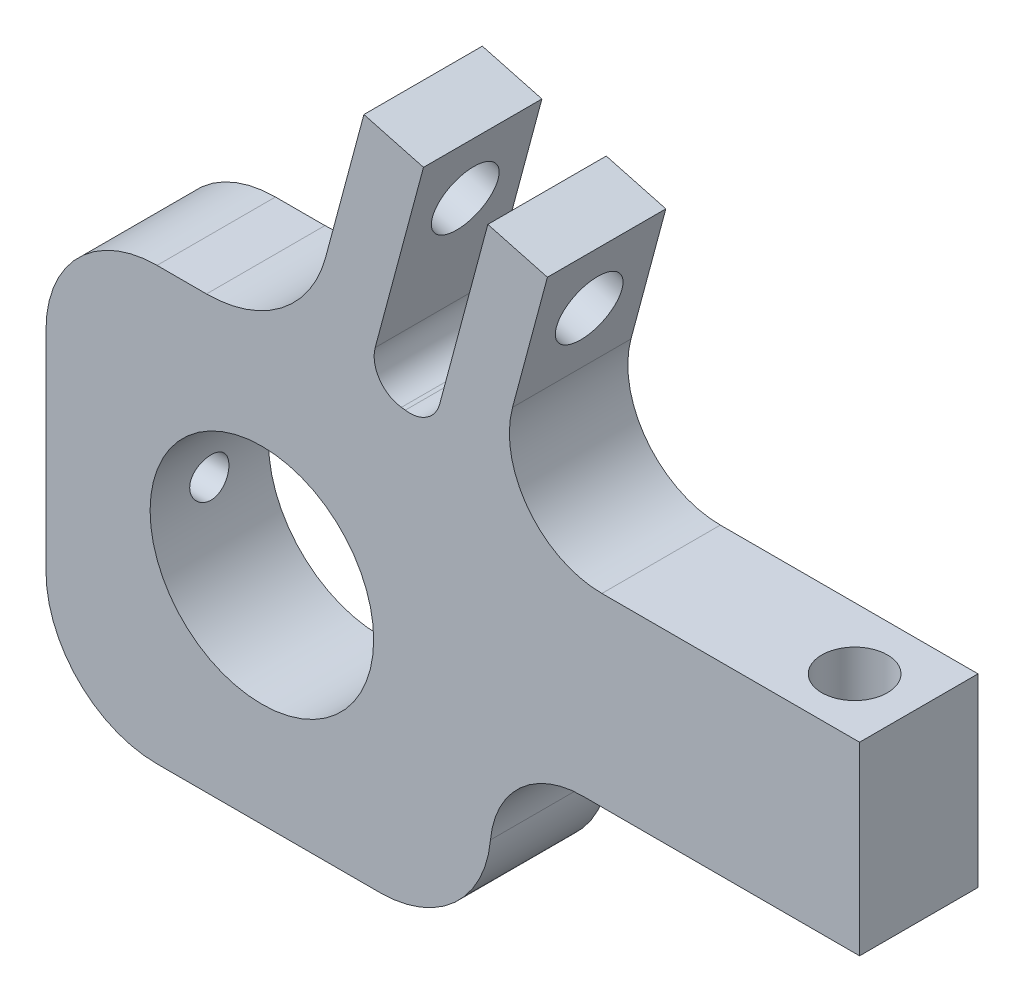
ISO-10303-21;
HEADER;
FILE_DESCRIPTION(('STEP AP214'),'2;1');
FILE_NAME('part.step','',(''),(''),'','','');
FILE_SCHEMA(('AUTOMOTIVE_DESIGN { 1 0 10303 214 1 1 1 1 }'));
ENDSEC;
DATA;
#1=APPLICATION_CONTEXT('core data for automotive mechanical design processes');
#2=APPLICATION_PROTOCOL_DEFINITION('international standard','automotive_design',2000,#1);
#3=PRODUCT_CONTEXT('',#1,'mechanical');
#4=PRODUCT('Part','Part','',(#3));
#5=PRODUCT_RELATED_PRODUCT_CATEGORY('part','',(#4));
#6=PRODUCT_DEFINITION_FORMATION('','',#4);
#7=PRODUCT_DEFINITION_CONTEXT('part definition',#1,'design');
#8=PRODUCT_DEFINITION('design','',#6,#7);
#9=PRODUCT_DEFINITION_SHAPE('','',#8);
#10=(LENGTH_UNIT() NAMED_UNIT(*) SI_UNIT(.MILLI.,.METRE.));
#11=(NAMED_UNIT(*) PLANE_ANGLE_UNIT() SI_UNIT($,.RADIAN.));
#12=(NAMED_UNIT(*) SI_UNIT($,.STERADIAN.) SOLID_ANGLE_UNIT());
#13=UNCERTAINTY_MEASURE_WITH_UNIT(LENGTH_MEASURE(1.E-05),#10,'distance_accuracy_value','');
#14=(GEOMETRIC_REPRESENTATION_CONTEXT(3) GLOBAL_UNCERTAINTY_ASSIGNED_CONTEXT((#13)) GLOBAL_UNIT_ASSIGNED_CONTEXT((#10,
#11,#12)) REPRESENTATION_CONTEXT('',''));
#15=CARTESIAN_POINT('',(0.,0.,0.));
#16=DIRECTION('',(0.,0.,1.));
#17=DIRECTION('',(1.,0.,0.));
#18=AXIS2_PLACEMENT_3D('',#15,#16,#17);
#19=CARTESIAN_POINT('',(0.,0.,6.096));
#20=DIRECTION('',(0.,-1.,0.));
#21=DIRECTION('',(0.,0.,-1.));
#22=AXIS2_PLACEMENT_3D('',#19,#20,#21);
#23=PLANE('',#22);
#24=DIRECTION('',(-1.,0.,0.));
#25=VECTOR('',#24,1.);
#26=CARTESIAN_POINT('',(0.,0.,6.096));
#27=LINE('',#26,#25);
#28=CARTESIAN_POINT('',(16.52517842443,0.,6.096));
#29=VERTEX_POINT('',#28);
#30=CARTESIAN_POINT('',(11.43,0.,6.096));
#31=VERTEX_POINT('',#30);
#32=EDGE_CURVE('E395',#29,#31,#27,.T.);
#33=ORIENTED_EDGE('',*,*,#32,.F.);
#34=DIRECTION('',(0.,0.,-1.));
#35=VECTOR('',#34,1.);
#36=CARTESIAN_POINT('',(16.52517842443,0.,-6.096));
#37=LINE('',#36,#35);
#38=CARTESIAN_POINT('',(16.52517842443,0.,-6.096));
#39=VERTEX_POINT('',#38);
#40=EDGE_CURVE('E333',#29,#39,#37,.T.);
#41=ORIENTED_EDGE('',*,*,#40,.T.);
#42=DIRECTION('',(-1.,0.,0.));
#43=VECTOR('',#42,1.);
#44=CARTESIAN_POINT('',(0.,0.,-6.096));
#45=LINE('',#44,#43);
#46=CARTESIAN_POINT('',(11.43,0.,-6.096));
#47=VERTEX_POINT('',#46);
#48=EDGE_CURVE('E396',#39,#47,#45,.T.);
#49=ORIENTED_EDGE('',*,*,#48,.T.);
#50=DIRECTION('',(0.,0.,-1.));
#51=VECTOR('',#50,1.);
#52=CARTESIAN_POINT('',(11.43,0.,6.096));
#53=LINE('',#52,#51);
#54=EDGE_CURVE('E384',#47,#31,#53,.F.);
#55=ORIENTED_EDGE('',*,*,#54,.T.);
#56=EDGE_LOOP('',(#33,#41,#49,#55));
#57=FACE_BOUND('',#56,.T.);
#58=ADVANCED_FACE('F36',(#57),#23,.F.);
#59=CARTESIAN_POINT('',(35.2757672756502,-11.43,-6.097));
#60=DIRECTION('',(0.,0.,1.));
#61=DIRECTION('',(1.,0.,0.));
#62=AXIS2_PLACEMENT_3D('',#59,#60,#61);
#63=CYLINDRICAL_SURFACE('',#62,11.43);
#64=CARTESIAN_POINT('',(35.2757672756502,-11.43,6.096));
#65=DIRECTION('',(0.,0.,1.));
#66=DIRECTION('',(1.,0.,0.));
#67=AXIS2_PLACEMENT_3D('',#64,#65,#66);
#68=CIRCLE('',#67,11.43);
#69=CARTESIAN_POINT('',(36.9880880456364,-0.128988647883148,6.096));
#70=VERTEX_POINT('',#69);
#71=CARTESIAN_POINT('',(36.5907256389474,-0.0758912942144651,6.096));
#72=VERTEX_POINT('',#71);
#73=EDGE_CURVE('E387',#70,#72,#68,.T.);
#74=ORIENTED_EDGE('',*,*,#73,.F.);
#75=DIRECTION('',(0.,0.,1.));
#76=VECTOR('',#75,1.);
#77=CARTESIAN_POINT('',(36.9880880456364,-0.128988647883146,-6.097));
#78=LINE('',#77,#76);
#79=CARTESIAN_POINT('',(36.9880880456364,-0.128988647883148,-6.096));
#80=VERTEX_POINT('',#79);
#81=EDGE_CURVE('E356',#70,#80,#78,.F.);
#82=ORIENTED_EDGE('',*,*,#81,.T.);
#83=CARTESIAN_POINT('',(35.2757672756502,-11.43,-6.096));
#84=DIRECTION('',(0.,0.,1.));
#85=DIRECTION('',(1.,0.,0.));
#86=AXIS2_PLACEMENT_3D('',#83,#84,#85);
#87=CIRCLE('',#86,11.43);
#88=CARTESIAN_POINT('',(36.5907256389474,-0.0758912942144651,-6.096));
#89=VERTEX_POINT('',#88);
#90=EDGE_CURVE('E374',#89,#80,#87,.F.);
#91=ORIENTED_EDGE('',*,*,#90,.F.);
#92=DIRECTION('',(0.,0.,1.));
#93=VECTOR('',#92,1.);
#94=CARTESIAN_POINT('',(36.5907256389474,-0.0758912942144651,-6.097));
#95=LINE('',#94,#93);
#96=EDGE_CURVE('E359',#89,#72,#95,.T.);
#97=ORIENTED_EDGE('',*,*,#96,.T.);
#98=EDGE_LOOP('',(#74,#82,#91,#97));
#99=FACE_BOUND('',#98,.T.);
#100=ADVANCED_FACE('F280',(#99),#63,.T.);
#101=CARTESIAN_POINT('',(0.,0.,6.096));
#102=DIRECTION('',(1.,0.,0.));
#103=DIRECTION('',(0.,1.,0.));
#104=AXIS2_PLACEMENT_3D('',#101,#102,#103);
#105=PLANE('',#104);
#106=CARTESIAN_POINT('',(0.,-22.225,0.));
#107=DIRECTION('',(-1.,0.,0.));
#108=DIRECTION('',(0.,-1.,0.));
#109=AXIS2_PLACEMENT_3D('',#106,#107,#108);
#110=CIRCLE('',#109,2.0193);
#111=CARTESIAN_POINT('',(0.,-24.2443,0.));
#112=VERTEX_POINT('',#111);
#113=EDGE_CURVE('E231',#112,#112,#110,.T.);
#114=ORIENTED_EDGE('',*,*,#113,.F.);
#115=EDGE_LOOP('',(#114));
#116=FACE_BOUND('',#115,.T.);
#117=DIRECTION('',(0.,-1.,0.));
#118=VECTOR('',#117,1.);
#119=CARTESIAN_POINT('',(0.,0.,-6.096));
#120=LINE('',#119,#118);
#121=CARTESIAN_POINT('',(0.,-11.43,-6.096));
#122=VERTEX_POINT('',#121);
#123=CARTESIAN_POINT('',(0.,-33.02,-6.096));
#124=VERTEX_POINT('',#123);
#125=EDGE_CURVE('E402',#122,#124,#120,.T.);
#126=ORIENTED_EDGE('',*,*,#125,.T.);
#127=DIRECTION('',(0.,0.,-1.));
#128=VECTOR('',#127,1.);
#129=CARTESIAN_POINT('',(0.,-33.02,6.096));
#130=LINE('',#129,#128);
#131=CARTESIAN_POINT('',(0.,-33.02,6.096));
#132=VERTEX_POINT('',#131);
#133=EDGE_CURVE('E361',#124,#132,#130,.F.);
#134=ORIENTED_EDGE('',*,*,#133,.T.);
#135=DIRECTION('',(0.,-1.,0.));
#136=VECTOR('',#135,1.);
#137=CARTESIAN_POINT('',(0.,0.,6.096));
#138=LINE('',#137,#136);
#139=CARTESIAN_POINT('',(0.,-11.43,6.096));
#140=VERTEX_POINT('',#139);
#141=EDGE_CURVE('E398',#140,#132,#138,.T.);
#142=ORIENTED_EDGE('',*,*,#141,.F.);
#143=DIRECTION('',(0.,0.,-1.));
#144=VECTOR('',#143,1.);
#145=CARTESIAN_POINT('',(0.,-11.43,6.096));
#146=LINE('',#145,#144);
#147=EDGE_CURVE('E363',#140,#122,#146,.T.);
#148=ORIENTED_EDGE('',*,*,#147,.T.);
#149=EDGE_LOOP('',(#126,#134,#142,#148));
#150=FACE_BOUND('',#149,.T.);
#151=ADVANCED_FACE('F286',(#116,#150),#105,.F.);
#152=CARTESIAN_POINT('',(0.,-44.45,6.096));
#153=DIRECTION('',(0.,1.,0.));
#154=DIRECTION('',(0.,0.,1.));
#155=AXIS2_PLACEMENT_3D('',#152,#153,#154);
#156=PLANE('',#155);
#157=DIRECTION('',(1.,0.,0.));
#158=VECTOR('',#157,1.);
#159=CARTESIAN_POINT('',(0.,-44.45,-6.096));
#160=LINE('',#159,#158);
#161=CARTESIAN_POINT('',(11.43,-44.45,-6.096));
#162=VERTEX_POINT('',#161);
#163=CARTESIAN_POINT('',(34.3767705590532,-44.45,-6.096));
#164=VERTEX_POINT('',#163);
#165=EDGE_CURVE('E399',#162,#164,#160,.T.);
#166=ORIENTED_EDGE('',*,*,#165,.T.);
#167=DIRECTION('',(0.,0.,1.));
#168=VECTOR('',#167,1.);
#169=CARTESIAN_POINT('',(34.3767705590532,-44.45,6.096));
#170=LINE('',#169,#168);
#171=CARTESIAN_POINT('',(34.3767705590532,-44.45,6.096));
#172=VERTEX_POINT('',#171);
#173=EDGE_CURVE('E368',#164,#172,#170,.T.);
#174=ORIENTED_EDGE('',*,*,#173,.T.);
#175=DIRECTION('',(1.,0.,0.));
#176=VECTOR('',#175,1.);
#177=CARTESIAN_POINT('',(0.,-44.45,6.096));
#178=LINE('',#177,#176);
#179=CARTESIAN_POINT('',(11.43,-44.45,6.096));
#180=VERTEX_POINT('',#179);
#181=EDGE_CURVE('E407',#180,#172,#178,.T.);
#182=ORIENTED_EDGE('',*,*,#181,.F.);
#183=DIRECTION('',(0.,0.,-1.));
#184=VECTOR('',#183,1.);
#185=CARTESIAN_POINT('',(11.43,-44.45,6.096));
#186=LINE('',#185,#184);
#187=EDGE_CURVE('E371',#180,#162,#186,.T.);
#188=ORIENTED_EDGE('',*,*,#187,.T.);
#189=EDGE_LOOP('',(#166,#174,#182,#188));
#190=FACE_BOUND('',#189,.T.);
#191=ADVANCED_FACE('F294',(#190),#156,.F.);
#192=CARTESIAN_POINT('',(0.,0.,6.096));
#193=DIRECTION('',(0.,0.,1.));
#194=DIRECTION('',(1.,0.,0.));
#195=AXIS2_PLACEMENT_3D('',#192,#193,#194);
#196=PLANE('',#195);
#197=DIRECTION('',(1.,0.,0.));
#198=VECTOR('',#197,1.);
#199=CARTESIAN_POINT('',(48.895,-6.35,6.096));
#200=LINE('',#199,#198);
#201=CARTESIAN_POINT('',(57.229907012598,-6.35,6.096));
#202=VERTEX_POINT('',#201);
#203=CARTESIAN_POINT('',(83.7565,-6.35,6.096));
#204=VERTEX_POINT('',#203);
#205=EDGE_CURVE('E430',#202,#204,#200,.T.);
#206=ORIENTED_EDGE('',*,*,#205,.F.);
#207=CARTESIAN_POINT('',(57.229907012598,3.175,6.096));
#208=DIRECTION('',(0.,0.,1.));
#209=DIRECTION('',(1.,0.,0.));
#210=AXIS2_PLACEMENT_3D('',#207,#208,#209);
#211=CIRCLE('',#210,9.525);
#212=CARTESIAN_POINT('',(48.0294635171947,5.64025140460154,6.096));
#213=VERTEX_POINT('',#212);
#214=EDGE_CURVE('E11',#202,#213,#211,.F.);
#215=ORIENTED_EDGE('',*,*,#214,.T.);
#216=DIRECTION('',(0.258819045102524,0.965925826289067,0.));
#217=VECTOR('',#216,1.);
#218=CARTESIAN_POINT('',(45.0452725784675,-5.49690079821473,6.096));
#219=LINE('',#218,#217);
#220=CARTESIAN_POINT('',(51.6192763240716,19.0376151895276,6.096));
#221=VERTEX_POINT('',#220);
#222=EDGE_CURVE('E214',#213,#221,#219,.T.);
#223=ORIENTED_EDGE('',*,*,#222,.T.);
#224=DIRECTION('',(-0.965925826289067,0.258819045102526,0.));
#225=VECTOR('',#224,1.);
#226=CARTESIAN_POINT('',(45.485647327136,20.6811161259286,6.096));
#227=LINE('',#226,#225);
#228=CARTESIAN_POINT('',(45.485647327136,20.6811161259286,6.096));
#229=VERTEX_POINT('',#228);
#230=EDGE_CURVE('E216',#221,#229,#227,.T.);
#231=ORIENTED_EDGE('',*,*,#230,.T.);
#232=DIRECTION('',(-0.258819045102525,-0.965925826289067,0.));
#233=VECTOR('',#232,1.);
#234=CARTESIAN_POINT('',(38.9116435815319,-3.8533998618137,6.096));
#235=LINE('',#234,#233);
#236=CARTESIAN_POINT('',(40.5305472024337,2.18843070394879,6.096));
#237=VERTEX_POINT('',#236);
#238=EDGE_CURVE('E219',#229,#237,#235,.T.);
#239=ORIENTED_EDGE('',*,*,#238,.T.);
#240=CARTESIAN_POINT('',(37.4637327039659,3.01018117214931,6.096));
#241=DIRECTION('',(0.,0.,1.));
#242=DIRECTION('',(1.,0.,0.));
#243=AXIS2_PLACEMENT_3D('',#240,#241,#242);
#244=CIRCLE('',#243,3.175);
#245=EDGE_CURVE('E348',#237,#70,#244,.F.);
#246=ORIENTED_EDGE('',*,*,#245,.T.);
#247=ORIENTED_EDGE('',*,*,#73,.T.);
#248=CARTESIAN_POINT('',(36.9559918509744,3.07802779072596,6.096));
#249=DIRECTION('',(0.,0.,1.));
#250=DIRECTION('',(1.,0.,0.));
#251=AXIS2_PLACEMENT_3D('',#248,#249,#250);
#252=CIRCLE('',#251,3.175);
#253=CARTESIAN_POINT('',(33.8891773525066,3.89977825892647,6.096));
#254=VERTEX_POINT('',#253);
#255=EDGE_CURVE('E187',#72,#254,#252,.F.);
#256=ORIENTED_EDGE('',*,*,#255,.T.);
#257=DIRECTION('',(0.258819045102524,0.965925826289067,0.));
#258=VECTOR('',#257,1.);
#259=CARTESIAN_POINT('',(32.8442349173668,0.,6.096));
#260=LINE('',#259,#258);
#261=CARTESIAN_POINT('',(38.8613280104456,22.4560971372417,6.096));
#262=VERTEX_POINT('',#261);
#263=EDGE_CURVE('E178',#254,#262,#260,.T.);
#264=ORIENTED_EDGE('',*,*,#263,.T.);
#265=DIRECTION('',(-0.965925826289068,0.258819045102524,0.));
#266=VECTOR('',#265,1.);
#267=CARTESIAN_POINT('',(38.8613280104456,22.4560971372417,6.096));
#268=LINE('',#267,#266);
#269=CARTESIAN_POINT('',(32.72769901351,24.0995980736427,6.096));
#270=VERTEX_POINT('',#269);
#271=EDGE_CURVE('E183',#262,#270,#268,.T.);
#272=ORIENTED_EDGE('',*,*,#271,.T.);
#273=DIRECTION('',(-0.258819045102524,-0.965925826289067,0.));
#274=VECTOR('',#273,1.);
#275=CARTESIAN_POINT('',(32.72769901351,24.0995980736427,6.096));
#276=LINE('',#275,#274);
#277=CARTESIAN_POINT('',(28.7924364183011,9.41299812719794,6.096));
#278=VERTEX_POINT('',#277);
#279=EDGE_CURVE('E201',#270,#278,#276,.T.);
#280=ORIENTED_EDGE('',*,*,#279,.T.);
#281=CARTESIAN_POINT('',(16.52517842443,12.7,6.096));
#282=DIRECTION('',(0.,0.,1.));
#283=DIRECTION('',(1.,0.,0.));
#284=AXIS2_PLACEMENT_3D('',#281,#282,#283);
#285=CIRCLE('',#284,12.7);
#286=EDGE_CURVE('E330',#278,#29,#285,.F.);
#287=ORIENTED_EDGE('',*,*,#286,.T.);
#288=ORIENTED_EDGE('',*,*,#32,.T.);
#289=CARTESIAN_POINT('',(11.43,-11.43,6.096));
#290=DIRECTION('',(0.,0.,1.));
#291=DIRECTION('',(1.,0.,0.));
#292=AXIS2_PLACEMENT_3D('',#289,#290,#291);
#293=CIRCLE('',#292,11.43);
#294=EDGE_CURVE('E393',#31,#140,#293,.T.);
#295=ORIENTED_EDGE('',*,*,#294,.T.);
#296=ORIENTED_EDGE('',*,*,#141,.T.);
#297=CARTESIAN_POINT('',(11.43,-33.02,6.096));
#298=DIRECTION('',(0.,0.,1.));
#299=DIRECTION('',(1.,0.,0.));
#300=AXIS2_PLACEMENT_3D('',#297,#298,#299);
#301=CIRCLE('',#300,11.43);
#302=EDGE_CURVE('E391',#132,#180,#301,.T.);
#303=ORIENTED_EDGE('',*,*,#302,.T.);
#304=ORIENTED_EDGE('',*,*,#181,.T.);
#305=CARTESIAN_POINT('',(34.3767705590532,-33.02,6.096));
#306=DIRECTION('',(0.,0.,1.));
#307=DIRECTION('',(1.,0.,0.));
#308=AXIS2_PLACEMENT_3D('',#305,#306,#307);
#309=CIRCLE('',#308,11.43);
#310=CARTESIAN_POINT('',(45.759441163206,-34.0590909090909,6.096));
#311=VERTEX_POINT('',#310);
#312=EDGE_CURVE('E389',#172,#311,#309,.T.);
#313=ORIENTED_EDGE('',*,*,#312,.T.);
#314=CARTESIAN_POINT('',(55.245,-34.925,6.096));
#315=DIRECTION('',(0.,0.,1.));
#316=DIRECTION('',(1.,0.,0.));
#317=AXIS2_PLACEMENT_3D('',#314,#315,#316);
#318=CIRCLE('',#317,9.52499999999999);
#319=CARTESIAN_POINT('',(55.245,-25.4,6.096));
#320=VERTEX_POINT('',#319);
#321=EDGE_CURVE('E424',#320,#311,#318,.T.);
#322=ORIENTED_EDGE('',*,*,#321,.F.);
#323=DIRECTION('',(-1.,0.,0.));
#324=VECTOR('',#323,1.);
#325=CARTESIAN_POINT('',(96.52,-25.4,6.096));
#326=LINE('',#325,#324);
#327=CARTESIAN_POINT('',(83.7565,-25.4,6.096));
#328=VERTEX_POINT('',#327);
#329=EDGE_CURVE('E422',#328,#320,#326,.T.);
#330=ORIENTED_EDGE('',*,*,#329,.F.);
#331=DIRECTION('',(0.,1.,0.));
#332=VECTOR('',#331,1.);
#333=CARTESIAN_POINT('',(83.7565,-44.45,6.096));
#334=LINE('',#333,#332);
#335=EDGE_CURVE('E443',#328,#204,#334,.T.);
#336=ORIENTED_EDGE('',*,*,#335,.T.);
#337=EDGE_LOOP('',(#206,#215,#223,#231,#239,#246,#247,#256,#264,#272,#280,#287,#288,#295,#296,
#303,#304,#313,#322,#330,#336));
#338=FACE_BOUND('',#337,.T.);
#339=CARTESIAN_POINT('',(22.225,-22.225,6.096));
#340=DIRECTION('',(0.,0.,1.));
#341=DIRECTION('',(1.,0.,0.));
#342=AXIS2_PLACEMENT_3D('',#339,#340,#341);
#343=CIRCLE('',#342,11.50874);
#344=CARTESIAN_POINT('',(33.73374,-22.225,6.096));
#345=VERTEX_POINT('',#344);
#346=EDGE_CURVE('E414',#345,#345,#343,.T.);
#347=ORIENTED_EDGE('',*,*,#346,.F.);
#348=EDGE_LOOP('',(#347));
#349=FACE_BOUND('',#348,.T.);
#350=ADVANCED_FACE('F180',(#338,#349),#196,.T.);
#351=CARTESIAN_POINT('',(0.,0.,-6.096));
#352=DIRECTION('',(0.,0.,1.));
#353=DIRECTION('',(1.,0.,0.));
#354=AXIS2_PLACEMENT_3D('',#351,#352,#353);
#355=PLANE('',#354);
#356=DIRECTION('',(0.258819045102524,0.965925826289067,0.));
#357=VECTOR('',#356,1.);
#358=CARTESIAN_POINT('',(45.0452725784675,-5.49690079821473,-6.096));
#359=LINE('',#358,#357);
#360=CARTESIAN_POINT('',(48.0294635171947,5.64025140460154,-6.096));
#361=VERTEX_POINT('',#360);
#362=CARTESIAN_POINT('',(51.6192763240716,19.0376151895276,-6.096));
#363=VERTEX_POINT('',#362);
#364=EDGE_CURVE('E207',#361,#363,#359,.T.);
#365=ORIENTED_EDGE('',*,*,#364,.F.);
#366=CARTESIAN_POINT('',(57.229907012598,3.175,-6.096));
#367=DIRECTION('',(0.,0.,1.));
#368=DIRECTION('',(1.,0.,0.));
#369=AXIS2_PLACEMENT_3D('',#366,#367,#368);
#370=CIRCLE('',#369,9.525);
#371=CARTESIAN_POINT('',(57.229907012598,-6.35,-6.096));
#372=VERTEX_POINT('',#371);
#373=EDGE_CURVE('E45',#361,#372,#370,.T.);
#374=ORIENTED_EDGE('',*,*,#373,.T.);
#375=DIRECTION('',(-1.,0.,0.));
#376=VECTOR('',#375,1.);
#377=CARTESIAN_POINT('',(48.895,-6.35,-6.096));
#378=LINE('',#377,#376);
#379=CARTESIAN_POINT('',(83.7565,-6.35,-6.096));
#380=VERTEX_POINT('',#379);
#381=EDGE_CURVE('E417',#380,#372,#378,.T.);
#382=ORIENTED_EDGE('',*,*,#381,.F.);
#383=DIRECTION('',(0.,1.,0.));
#384=VECTOR('',#383,1.);
#385=CARTESIAN_POINT('',(83.7565,-44.45,-6.096));
#386=LINE('',#385,#384);
#387=CARTESIAN_POINT('',(83.7565,-25.4,-6.096));
#388=VERTEX_POINT('',#387);
#389=EDGE_CURVE('E444',#388,#380,#386,.T.);
#390=ORIENTED_EDGE('',*,*,#389,.F.);
#391=DIRECTION('',(1.,0.,0.));
#392=VECTOR('',#391,1.);
#393=CARTESIAN_POINT('',(96.52,-25.4,-6.096));
#394=LINE('',#393,#392);
#395=CARTESIAN_POINT('',(55.245,-25.4,-6.096));
#396=VERTEX_POINT('',#395);
#397=EDGE_CURVE('E427',#396,#388,#394,.T.);
#398=ORIENTED_EDGE('',*,*,#397,.F.);
#399=CARTESIAN_POINT('',(55.245,-34.925,-6.096));
#400=DIRECTION('',(0.,0.,1.));
#401=DIRECTION('',(1.,0.,0.));
#402=AXIS2_PLACEMENT_3D('',#399,#400,#401);
#403=CIRCLE('',#402,9.52499999999999);
#404=CARTESIAN_POINT('',(45.759441163206,-34.0590909090909,-6.096));
#405=VERTEX_POINT('',#404);
#406=EDGE_CURVE('E433',#405,#396,#403,.F.);
#407=ORIENTED_EDGE('',*,*,#406,.F.);
#408=CARTESIAN_POINT('',(34.3767705590532,-33.02,-6.096));
#409=DIRECTION('',(0.,0.,1.));
#410=DIRECTION('',(1.,0.,0.));
#411=AXIS2_PLACEMENT_3D('',#408,#409,#410);
#412=CIRCLE('',#411,11.43);
#413=EDGE_CURVE('E377',#405,#164,#412,.F.);
#414=ORIENTED_EDGE('',*,*,#413,.T.);
#415=ORIENTED_EDGE('',*,*,#165,.F.);
#416=CARTESIAN_POINT('',(11.43,-33.02,-6.096));
#417=DIRECTION('',(0.,0.,1.));
#418=DIRECTION('',(1.,0.,0.));
#419=AXIS2_PLACEMENT_3D('',#416,#417,#418);
#420=CIRCLE('',#419,11.43);
#421=EDGE_CURVE('E379',#162,#124,#420,.F.);
#422=ORIENTED_EDGE('',*,*,#421,.T.);
#423=ORIENTED_EDGE('',*,*,#125,.F.);
#424=CARTESIAN_POINT('',(11.43,-11.43,-6.096));
#425=DIRECTION('',(0.,0.,1.));
#426=DIRECTION('',(1.,0.,0.));
#427=AXIS2_PLACEMENT_3D('',#424,#425,#426);
#428=CIRCLE('',#427,11.43);
#429=EDGE_CURVE('E381',#122,#47,#428,.F.);
#430=ORIENTED_EDGE('',*,*,#429,.T.);
#431=ORIENTED_EDGE('',*,*,#48,.F.);
#432=CARTESIAN_POINT('',(16.52517842443,12.7,-6.096));
#433=DIRECTION('',(0.,0.,1.));
#434=DIRECTION('',(1.,0.,0.));
#435=AXIS2_PLACEMENT_3D('',#432,#433,#434);
#436=CIRCLE('',#435,12.7);
#437=CARTESIAN_POINT('',(28.7924364183011,9.41299812719794,-6.096));
#438=VERTEX_POINT('',#437);
#439=EDGE_CURVE('E335',#39,#438,#436,.T.);
#440=ORIENTED_EDGE('',*,*,#439,.T.);
#441=DIRECTION('',(-0.258819045102524,-0.965925826289067,0.));
#442=VECTOR('',#441,1.);
#443=CARTESIAN_POINT('',(32.72769901351,24.0995980736427,-6.096));
#444=LINE('',#443,#442);
#445=CARTESIAN_POINT('',(32.72769901351,24.0995980736427,-6.096));
#446=VERTEX_POINT('',#445);
#447=EDGE_CURVE('E192',#446,#438,#444,.T.);
#448=ORIENTED_EDGE('',*,*,#447,.F.);
#449=DIRECTION('',(-0.965925826289068,0.258819045102524,0.));
#450=VECTOR('',#449,1.);
#451=CARTESIAN_POINT('',(38.8613280104456,22.4560971372417,-6.096));
#452=LINE('',#451,#450);
#453=CARTESIAN_POINT('',(38.8613280104456,22.4560971372417,-6.096));
#454=VERTEX_POINT('',#453);
#455=EDGE_CURVE('E481',#454,#446,#452,.T.);
#456=ORIENTED_EDGE('',*,*,#455,.F.);
#457=DIRECTION('',(0.258819045102524,0.965925826289067,0.));
#458=VECTOR('',#457,1.);
#459=CARTESIAN_POINT('',(32.8442349173668,0.,-6.096));
#460=LINE('',#459,#458);
#461=CARTESIAN_POINT('',(33.8891773525066,3.89977825892647,-6.096));
#462=VERTEX_POINT('',#461);
#463=EDGE_CURVE('E205',#462,#454,#460,.T.);
#464=ORIENTED_EDGE('',*,*,#463,.F.);
#465=CARTESIAN_POINT('',(36.9559918509744,3.07802779072596,-6.096));
#466=DIRECTION('',(0.,0.,1.));
#467=DIRECTION('',(1.,0.,0.));
#468=AXIS2_PLACEMENT_3D('',#465,#466,#467);
#469=CIRCLE('',#468,3.175);
#470=EDGE_CURVE('E346',#462,#89,#469,.T.);
#471=ORIENTED_EDGE('',*,*,#470,.T.);
#472=ORIENTED_EDGE('',*,*,#90,.T.);
#473=CARTESIAN_POINT('',(37.4637327039659,3.01018117214931,-6.096));
#474=DIRECTION('',(0.,0.,1.));
#475=DIRECTION('',(1.,0.,0.));
#476=AXIS2_PLACEMENT_3D('',#473,#474,#475);
#477=CIRCLE('',#476,3.175);
#478=CARTESIAN_POINT('',(40.5305472024337,2.18843070394879,-6.096));
#479=VERTEX_POINT('',#478);
#480=EDGE_CURVE('E350',#80,#479,#477,.T.);
#481=ORIENTED_EDGE('',*,*,#480,.T.);
#482=DIRECTION('',(-0.258819045102525,-0.965925826289067,0.));
#483=VECTOR('',#482,1.);
#484=CARTESIAN_POINT('',(38.9116435815319,-3.8533998618137,-6.096));
#485=LINE('',#484,#483);
#486=CARTESIAN_POINT('',(45.485647327136,20.6811161259286,-6.096));
#487=VERTEX_POINT('',#486);
#488=EDGE_CURVE('E217',#487,#479,#485,.T.);
#489=ORIENTED_EDGE('',*,*,#488,.F.);
#490=DIRECTION('',(-0.965925826289067,0.258819045102526,0.));
#491=VECTOR('',#490,1.);
#492=CARTESIAN_POINT('',(45.485647327136,20.6811161259286,-6.096));
#493=LINE('',#492,#491);
#494=EDGE_CURVE('E209',#363,#487,#493,.T.);
#495=ORIENTED_EDGE('',*,*,#494,.F.);
#496=EDGE_LOOP('',(#365,#374,#382,#390,#398,#407,#414,#415,#422,#423,#430,#431,#440,#448,#456,
#464,#471,#472,#481,#489,#495));
#497=FACE_BOUND('',#496,.T.);
#498=CARTESIAN_POINT('',(22.225,-22.225,-6.096));
#499=DIRECTION('',(0.,0.,1.));
#500=DIRECTION('',(1.,0.,0.));
#501=AXIS2_PLACEMENT_3D('',#498,#499,#500);
#502=CIRCLE('',#501,11.50874);
#503=CARTESIAN_POINT('',(33.73374,-22.225,-6.096));
#504=VERTEX_POINT('',#503);
#505=EDGE_CURVE('E405',#504,#504,#502,.F.);
#506=ORIENTED_EDGE('',*,*,#505,.F.);
#507=EDGE_LOOP('',(#506));
#508=FACE_BOUND('',#507,.T.);
#509=ADVANCED_FACE('F292',(#497,#508),#355,.F.);
#510=CARTESIAN_POINT('',(22.225,-22.225,-6.097));
#511=DIRECTION('',(0.,0.,1.));
#512=DIRECTION('',(1.,0.,0.));
#513=AXIS2_PLACEMENT_3D('',#510,#511,#512);
#514=CYLINDRICAL_SURFACE('',#513,11.50874);
#515=CARTESIAN_POINT('',(10.8947959463388,-24.2443,0.));
#516=CARTESIAN_POINT('',(10.8947938476615,-24.2442955587636,-0.112484315058334));
#517=CARTESIAN_POINT('',(10.8931026901516,-24.2348693034159,-0.225027839992));
#518=CARTESIAN_POINT('',(10.8865278658225,-24.1974333969111,-0.446950726781656));
#519=CARTESIAN_POINT('',(10.881641351309,-24.1694071691715,-0.556327175262987));
#520=CARTESIAN_POINT('',(10.8692459043424,-24.0956506529227,-0.768672367748102));
#521=CARTESIAN_POINT('',(10.8617392663914,-24.0499358509119,-0.871646625643409));
#522=CARTESIAN_POINT('',(10.8449520932996,-23.9421394795159,-1.06845448332941));
#523=CARTESIAN_POINT('',(10.8356717326956,-23.8800595202557,-1.16228898111401));
#524=CARTESIAN_POINT('',(10.8162696436178,-23.740572709988,-1.33918706367677));
#525=CARTESIAN_POINT('',(10.8061405797441,-23.6630220180086,-1.42213643936239));
#526=CARTESIAN_POINT('',(10.7862473804422,-23.495106005769,-1.57391639177198));
#527=CARTESIAN_POINT('',(10.7764832676025,-23.4047398939582,-1.6427460957446));
#528=CARTESIAN_POINT('',(10.7583420852283,-23.2130139329352,-1.76476529035631));
#529=CARTESIAN_POINT('',(10.7499746550432,-23.1115850767058,-1.81784790746367));
#530=CARTESIAN_POINT('',(10.7356514501004,-22.9010784099242,-1.90617851402013));
#531=CARTESIAN_POINT('',(10.7296955016914,-22.7920011507992,-1.9414277876981));
#532=CARTESIAN_POINT('',(10.7209181305091,-22.5704755109144,-1.99274018835448));
#533=CARTESIAN_POINT('',(10.7180653316371,-22.4580729078239,-2.00899549130518));
#534=CARTESIAN_POINT('',(10.7157077499796,-22.232102013146,-2.02245660038843));
#535=CARTESIAN_POINT('',(10.716202716121,-22.1185338096133,-2.01966383507276));
#536=CARTESIAN_POINT('',(10.7204601878388,-21.8947710716639,-1.99525694032567));
#537=CARTESIAN_POINT('',(10.7241867794439,-21.7845531924422,-1.97384967205365));
#538=CARTESIAN_POINT('',(10.7344486535498,-21.5692985970501,-1.91314776307454));
#539=CARTESIAN_POINT('',(10.7409840286825,-21.4642620518843,-1.87385253243051));
#540=CARTESIAN_POINT('',(10.7561898616943,-21.2617427330325,-1.77828804288963));
#541=CARTESIAN_POINT('',(10.764870870039,-21.1643005139474,-1.72193458830662));
#542=CARTESIAN_POINT('',(10.7834052858989,-20.9801777388536,-1.59391514194663));
#543=CARTESIAN_POINT('',(10.7932587982526,-20.8934981465949,-1.52224778043226));
#544=CARTESIAN_POINT('',(10.8132004730139,-20.7321374904033,-1.36449054172143));
#545=CARTESIAN_POINT('',(10.823290009273,-20.6576333296655,-1.27821978389511));
#546=CARTESIAN_POINT('',(10.8424391171698,-20.5241276460946,-1.0943112781641));
#547=CARTESIAN_POINT('',(10.8514986772003,-20.46512629796,-0.996673402183194));
#548=CARTESIAN_POINT('',(10.8675633372225,-20.3642599576385,-0.792585129339584));
#549=CARTESIAN_POINT('',(10.8745656651523,-20.3224180575568,-0.686123087425597));
#550=CARTESIAN_POINT('',(10.885678662022,-20.2572624357748,-0.467530620096599));
#551=CARTESIAN_POINT('',(10.8897896150607,-20.2339468936935,-0.355400752748157));
#552=CARTESIAN_POINT('',(10.8945989084346,-20.2067586655983,-0.130243463454956));
#553=CARTESIAN_POINT('',(10.8953416491357,-20.2026329965373,-0.0172475087216784));
#554=CARTESIAN_POINT('',(10.8934489092668,-20.2132658359675,0.207819622359044));
#555=CARTESIAN_POINT('',(10.8908135739896,-20.228023532275,0.319890838271349));
#556=CARTESIAN_POINT('',(10.8825027774839,-20.2757878750338,0.539112165927814));
#557=CARTESIAN_POINT('',(10.8768490385347,-20.3086641827865,0.646291572910966));
#558=CARTESIAN_POINT('',(10.8631568926166,-20.3915951651507,0.853620092003147));
#559=CARTESIAN_POINT('',(10.8551183292689,-20.441650966297,0.953768742555681));
#560=CARTESIAN_POINT('',(10.8374599483136,-20.5581110432462,1.14531416685488));
#561=CARTESIAN_POINT('',(10.827824872291,-20.624676497505,1.23661151122036));
#562=CARTESIAN_POINT('',(10.8081030157112,-20.7720467016081,1.4068314591229));
#563=CARTESIAN_POINT('',(10.7980161998419,-20.8528525660671,1.48575309308306));
#564=CARTESIAN_POINT('',(10.7783860306619,-21.0275343679961,1.62991382031101));
#565=CARTESIAN_POINT('',(10.7688503370094,-21.1215510193084,1.69498361211669));
#566=CARTESIAN_POINT('',(10.7515220892431,-21.3193285551062,1.80840404493824));
#567=CARTESIAN_POINT('',(10.7437294741695,-21.4230890986439,1.85675527067512));
#568=CARTESIAN_POINT('',(10.730798548156,-21.6369205020482,1.93510666714343));
#569=CARTESIAN_POINT('',(10.7256477643493,-21.7469589315777,1.96519319697701));
#570=CARTESIAN_POINT('',(10.7185279240057,-21.9706250017511,2.00643828967458));
#571=CARTESIAN_POINT('',(10.7165585760295,-22.0842523126587,2.01759858630414));
#572=CARTESIAN_POINT('',(10.7160283027246,-22.3102409546617,2.02062023512598));
#573=CARTESIAN_POINT('',(10.7174220214713,-22.4225988275057,2.01273839689941));
#574=CARTESIAN_POINT('',(10.7233680198097,-22.6443635914923,1.97845783149501));
#575=CARTESIAN_POINT('',(10.7279202768514,-22.7537705036971,1.95205923651536));
#576=CARTESIAN_POINT('',(10.7396730506785,-22.9664141618566,1.88159709839727));
#577=CARTESIAN_POINT('',(10.7468699536602,-23.069659105157,1.83755765341918));
#578=CARTESIAN_POINT('',(10.7631290806161,-23.2673335415215,1.7330933672795));
#579=CARTESIAN_POINT('',(10.7721914082485,-23.3617625442765,1.67266761550262));
#580=CARTESIAN_POINT('',(10.7913229834827,-23.5404127414064,1.53624626931999));
#581=CARTESIAN_POINT('',(10.8014035059715,-23.6244898982455,1.4600636110922));
#582=CARTESIAN_POINT('',(10.8213601495358,-23.7787568626839,1.29468202677487));
#583=CARTESIAN_POINT('',(10.8312362221463,-23.848943410509,1.20548005389501));
#584=CARTESIAN_POINT('',(10.8497508862273,-23.9739541473658,1.01574773165492));
#585=CARTESIAN_POINT('',(10.8583790271619,-24.0286519071298,0.91513304216098));
#586=CARTESIAN_POINT('',(10.8732965959838,-24.1202834829497,0.706029188603576));
#587=CARTESIAN_POINT('',(10.8795883066517,-24.1572346485102,0.59754783512541));
#588=CARTESIAN_POINT('',(10.8877590859992,-24.2045079514073,0.407236787515311));
#589=CARTESIAN_POINT('',(10.8903828345252,-24.2194053730711,0.326544654088598));
#590=CARTESIAN_POINT('',(10.8939020107419,-24.2393029088318,0.163912143822917));
#591=CARTESIAN_POINT('',(10.8947974757285,-24.2443032365056,0.0819717939586025));
#592=CARTESIAN_POINT('',(10.8947959463388,-24.2443,0.));
#593=B_SPLINE_CURVE_WITH_KNOTS('',3,(#515,#516,#517,#518,#519,#520,#521,#522,#523,#524,#525,
#526,#527,#528,#529,#530,#531,#532,#533,#534,#535,#536,#537,#538,#539,#540,#541,#542,#543,#544,
#545,#546,#547,#548,#549,#550,#551,#552,#553,#554,#555,#556,#557,#558,#559,#560,#561,#562,#563,
#564,#565,#566,#567,#568,#569,#570,#571,#572,#573,#574,#575,#576,#577,#578,#579,#580,#581,#582,
#583,#584,#585,#586,#587,#588,#589,#590,#591,#592),.UNSPECIFIED.,.T.,.F.,(4,2,2,2,2,2,2,2,2,2,2,
2,2,2,2,2,2,2,2,2,2,2,2,2,2,2,2,2,2,2,2,2,2,2,2,2,2,2,4),(0.,0.337153101715194,
0.674607083704573,1.01176628790812,1.34889233227349,1.68931264632495,2.029753995768,
2.37245562572021,2.71513257325696,3.05431153248167,3.3934650545141,3.72889707973613,
4.06434016815676,4.40146670177696,4.73862340198108,5.08031115239532,5.42200275306523,
5.76415268369773,6.10626899087048,6.44386209687379,6.78144068330458,7.11662196401168,
7.45182522822945,7.79043951441136,8.12908031614045,8.47164857176509,8.81420484507458,
9.15512856679214,9.49602105600088,9.83234185987181,10.1686602626448,10.5045207982731,
10.8404000020758,11.1805226909493,11.5207251036078,11.8636292876279,12.2061975542754,
12.4518997305466,12.6975966045682),.UNSPECIFIED.);
#594=CARTESIAN_POINT('',(10.8947959463388,-24.2443,0.));
#595=VERTEX_POINT('',#594);
#596=EDGE_CURVE('E232',#595,#595,#593,.T.);
#597=ORIENTED_EDGE('',*,*,#596,.F.);
#598=EDGE_LOOP('',(#597));
#599=FACE_BOUND('',#598,.T.);
#600=ORIENTED_EDGE('',*,*,#346,.T.);
#601=EDGE_LOOP('',(#600));
#602=FACE_BOUND('',#601,.T.);
#603=ORIENTED_EDGE('',*,*,#505,.T.);
#604=EDGE_LOOP('',(#603));
#605=FACE_BOUND('',#604,.T.);
#606=ADVANCED_FACE('F531',(#599,#602,#605),#514,.F.);
#607=CARTESIAN_POINT('',(55.245,-34.925,-6.097));
#608=DIRECTION('',(0.,0.,1.));
#609=DIRECTION('',(1.,0.,0.));
#610=AXIS2_PLACEMENT_3D('',#607,#608,#609);
#611=CYLINDRICAL_SURFACE('',#610,9.52499999999999);
#612=ORIENTED_EDGE('',*,*,#321,.T.);
#613=DIRECTION('',(0.,0.,1.));
#614=VECTOR('',#613,1.);
#615=CARTESIAN_POINT('',(45.759441163206,-34.0590909090909,-6.097));
#616=LINE('',#615,#614);
#617=EDGE_CURVE('E366',#311,#405,#616,.F.);
#618=ORIENTED_EDGE('',*,*,#617,.T.);
#619=ORIENTED_EDGE('',*,*,#406,.T.);
#620=DIRECTION('',(0.,0.,1.));
#621=VECTOR('',#620,1.);
#622=CARTESIAN_POINT('',(55.245,-25.4,-6.097));
#623=LINE('',#622,#621);
#624=EDGE_CURVE('E418',#396,#320,#623,.T.);
#625=ORIENTED_EDGE('',*,*,#624,.T.);
#626=EDGE_LOOP('',(#612,#618,#619,#625));
#627=FACE_BOUND('',#626,.T.);
#628=ADVANCED_FACE('F460',(#627),#611,.F.);
#629=CARTESIAN_POINT('',(96.52,-25.4,-6.097));
#630=DIRECTION('',(0.,1.,0.));
#631=DIRECTION('',(-1.,0.,0.));
#632=AXIS2_PLACEMENT_3D('',#629,#630,#631);
#633=PLANE('',#632);
#634=ORIENTED_EDGE('',*,*,#397,.T.);
#635=DIRECTION('',(0.,0.,1.));
#636=VECTOR('',#635,1.);
#637=CARTESIAN_POINT('',(83.7565,-25.4,-6.097));
#638=LINE('',#637,#636);
#639=EDGE_CURVE('E435',#388,#328,#638,.T.);
#640=ORIENTED_EDGE('',*,*,#639,.T.);
#641=ORIENTED_EDGE('',*,*,#329,.T.);
#642=ORIENTED_EDGE('',*,*,#624,.F.);
#643=EDGE_LOOP('',(#634,#640,#641,#642));
#644=FACE_BOUND('',#643,.T.);
#645=CARTESIAN_POINT('',(77.4065,-25.4,0.254));
#646=DIRECTION('',(0.,1.,0.));
#647=DIRECTION('',(-1.,0.,0.));
#648=AXIS2_PLACEMENT_3D('',#645,#646,#647);
#649=CIRCLE('',#648,3.37819999999999);
#650=CARTESIAN_POINT('',(74.0283,-25.4,0.254));
#651=VERTEX_POINT('',#650);
#652=EDGE_CURVE('E421',#651,#651,#649,.T.);
#653=ORIENTED_EDGE('',*,*,#652,.T.);
#654=EDGE_LOOP('',(#653));
#655=FACE_BOUND('',#654,.T.);
#656=ADVANCED_FACE('F456',(#644,#655),#633,.F.);
#657=CARTESIAN_POINT('',(48.895,-6.35,-6.097));
#658=DIRECTION('',(0.,-1.,0.));
#659=DIRECTION('',(0.,0.,-1.));
#660=AXIS2_PLACEMENT_3D('',#657,#658,#659);
#661=PLANE('',#660);
#662=ORIENTED_EDGE('',*,*,#381,.T.);
#663=DIRECTION('',(0.,0.,-1.));
#664=VECTOR('',#663,1.);
#665=CARTESIAN_POINT('',(57.229907012598,-6.35,6.096));
#666=LINE('',#665,#664);
#667=EDGE_CURVE('E58',#372,#202,#666,.F.);
#668=ORIENTED_EDGE('',*,*,#667,.T.);
#669=ORIENTED_EDGE('',*,*,#205,.T.);
#670=DIRECTION('',(0.,0.,1.));
#671=VECTOR('',#670,1.);
#672=CARTESIAN_POINT('',(83.7565,-6.35,6.096));
#673=LINE('',#672,#671);
#674=EDGE_CURVE('E240',#380,#204,#673,.T.);
#675=ORIENTED_EDGE('',*,*,#674,.F.);
#676=EDGE_LOOP('',(#662,#668,#669,#675));
#677=FACE_BOUND('',#676,.T.);
#678=CARTESIAN_POINT('',(77.4065,-6.35,0.254));
#679=DIRECTION('',(0.,-1.,0.));
#680=DIRECTION('',(0.,0.,-1.));
#681=AXIS2_PLACEMENT_3D('',#678,#679,#680);
#682=CIRCLE('',#681,3.37819999999999);
#683=CARTESIAN_POINT('',(77.4065,-6.35,-3.12419999999999));
#684=VERTEX_POINT('',#683);
#685=EDGE_CURVE('E437',#684,#684,#682,.T.);
#686=ORIENTED_EDGE('',*,*,#685,.T.);
#687=EDGE_LOOP('',(#686));
#688=FACE_BOUND('',#687,.T.);
#689=ADVANCED_FACE('F515',(#677,#688),#661,.F.);
#690=CARTESIAN_POINT('',(77.4065,-44.451,0.254));
#691=DIRECTION('',(0.,1.,0.));
#692=DIRECTION('',(0.,0.,1.));
#693=AXIS2_PLACEMENT_3D('',#690,#691,#692);
#694=CYLINDRICAL_SURFACE('',#693,3.37819999999999);
#695=ORIENTED_EDGE('',*,*,#685,.F.);
#696=EDGE_LOOP('',(#695));
#697=FACE_BOUND('',#696,.T.);
#698=ORIENTED_EDGE('',*,*,#652,.F.);
#699=EDGE_LOOP('',(#698));
#700=FACE_BOUND('',#699,.T.);
#701=ADVANCED_FACE('F518',(#697,#700),#694,.F.);
#702=CARTESIAN_POINT('',(83.7565,-44.45,6.096));
#703=DIRECTION('',(-1.,0.,0.));
#704=DIRECTION('',(0.,0.,1.));
#705=AXIS2_PLACEMENT_3D('',#702,#703,#704);
#706=PLANE('',#705);
#707=ORIENTED_EDGE('',*,*,#389,.T.);
#708=ORIENTED_EDGE('',*,*,#674,.T.);
#709=ORIENTED_EDGE('',*,*,#335,.F.);
#710=ORIENTED_EDGE('',*,*,#639,.F.);
#711=EDGE_LOOP('',(#707,#708,#709,#710));
#712=FACE_BOUND('',#711,.T.);
#713=ADVANCED_FACE('F305',(#712),#706,.F.);
#714=CARTESIAN_POINT('',(34.3767705590532,-33.02,-6.097));
#715=DIRECTION('',(0.,0.,1.));
#716=DIRECTION('',(1.,0.,0.));
#717=AXIS2_PLACEMENT_3D('',#714,#715,#716);
#718=CYLINDRICAL_SURFACE('',#717,11.43);
#719=ORIENTED_EDGE('',*,*,#413,.F.);
#720=ORIENTED_EDGE('',*,*,#617,.F.);
#721=ORIENTED_EDGE('',*,*,#312,.F.);
#722=ORIENTED_EDGE('',*,*,#173,.F.);
#723=EDGE_LOOP('',(#719,#720,#721,#722));
#724=FACE_BOUND('',#723,.T.);
#725=ADVANCED_FACE('F301',(#724),#718,.T.);
#726=CARTESIAN_POINT('',(11.43,-33.02,6.096));
#727=DIRECTION('',(0.,0.,-1.));
#728=DIRECTION('',(-1.,0.,0.));
#729=AXIS2_PLACEMENT_3D('',#726,#727,#728);
#730=CYLINDRICAL_SURFACE('',#729,11.43);
#731=ORIENTED_EDGE('',*,*,#302,.F.);
#732=ORIENTED_EDGE('',*,*,#133,.F.);
#733=ORIENTED_EDGE('',*,*,#421,.F.);
#734=ORIENTED_EDGE('',*,*,#187,.F.);
#735=EDGE_LOOP('',(#731,#732,#733,#734));
#736=FACE_BOUND('',#735,.T.);
#737=ADVANCED_FACE('F304',(#736),#730,.T.);
#738=CARTESIAN_POINT('',(11.43,-11.43,6.096));
#739=DIRECTION('',(0.,0.,-1.));
#740=DIRECTION('',(-1.,0.,0.));
#741=AXIS2_PLACEMENT_3D('',#738,#739,#740);
#742=CYLINDRICAL_SURFACE('',#741,11.43);
#743=ORIENTED_EDGE('',*,*,#294,.F.);
#744=ORIENTED_EDGE('',*,*,#54,.F.);
#745=ORIENTED_EDGE('',*,*,#429,.F.);
#746=ORIENTED_EDGE('',*,*,#147,.F.);
#747=EDGE_LOOP('',(#743,#744,#745,#746));
#748=FACE_BOUND('',#747,.T.);
#749=ADVANCED_FACE('F309',(#748),#742,.T.);
#750=CARTESIAN_POINT('',(83.7575,-22.225,0.));
#751=DIRECTION('',(-1.,0.,0.));
#752=DIRECTION('',(0.,-1.,0.));
#753=AXIS2_PLACEMENT_3D('',#750,#751,#752);
#754=CYLINDRICAL_SURFACE('',#753,2.0193);
#755=ORIENTED_EDGE('',*,*,#113,.T.);
#756=EDGE_LOOP('',(#755));
#757=FACE_BOUND('',#756,.T.);
#758=ORIENTED_EDGE('',*,*,#596,.T.);
#759=EDGE_LOOP('',(#758));
#760=FACE_BOUND('',#759,.T.);
#761=ADVANCED_FACE('F242',(#757,#760),#754,.F.);
#762=CARTESIAN_POINT('',(45.0452725784675,-5.49690079821473,6.096));
#763=DIRECTION('',(-0.965925826289067,0.258819045102524,0.));
#764=DIRECTION('',(-0.258819045102524,-0.965925826289068,0.));
#765=AXIS2_PLACEMENT_3D('',#762,#763,#764);
#766=PLANE('',#765);
#767=CARTESIAN_POINT('',(49.8232585007726,12.3347854216764,0.));
#768=DIRECTION('',(-0.965925826289067,0.258819045102524,0.));
#769=DIRECTION('',(-0.258819045102524,-0.965925826289068,0.));
#770=AXIS2_PLACEMENT_3D('',#767,#768,#769);
#771=CIRCLE('',#770,3.3782);
#772=CARTESIAN_POINT('',(48.9489160026072,9.07169479530665,0.));
#773=VERTEX_POINT('',#772);
#774=EDGE_CURVE('E485',#773,#773,#771,.T.);
#775=ORIENTED_EDGE('',*,*,#774,.T.);
#776=EDGE_LOOP('',(#775));
#777=FACE_BOUND('',#776,.T.);
#778=ORIENTED_EDGE('',*,*,#222,.F.);
#779=DIRECTION('',(0.,0.,-1.));
#780=VECTOR('',#779,1.);
#781=CARTESIAN_POINT('',(48.0294635171947,5.64025140460154,6.096));
#782=LINE('',#781,#780);
#783=EDGE_CURVE('E334',#213,#361,#782,.T.);
#784=ORIENTED_EDGE('',*,*,#783,.T.);
#785=ORIENTED_EDGE('',*,*,#364,.T.);
#786=DIRECTION('',(0.,0.,-1.));
#787=VECTOR('',#786,1.);
#788=CARTESIAN_POINT('',(51.6192763240716,19.0376151895276,6.096));
#789=LINE('',#788,#787);
#790=EDGE_CURVE('E228',#221,#363,#789,.T.);
#791=ORIENTED_EDGE('',*,*,#790,.F.);
#792=EDGE_LOOP('',(#778,#784,#785,#791));
#793=FACE_BOUND('',#792,.T.);
#794=ADVANCED_FACE('F247',(#777,#793),#766,.F.);
#795=CARTESIAN_POINT('',(45.485647327136,20.6811161259286,6.096));
#796=DIRECTION('',(-0.258819045102526,-0.965925826289067,0.));
#797=DIRECTION('',(0.965925826289067,-0.258819045102526,0.));
#798=AXIS2_PLACEMENT_3D('',#795,#796,#797);
#799=PLANE('',#798);
#800=ORIENTED_EDGE('',*,*,#494,.T.);
#801=DIRECTION('',(0.,0.,-1.));
#802=VECTOR('',#801,1.);
#803=CARTESIAN_POINT('',(45.485647327136,20.6811161259286,6.096));
#804=LINE('',#803,#802);
#805=EDGE_CURVE('E221',#229,#487,#804,.T.);
#806=ORIENTED_EDGE('',*,*,#805,.F.);
#807=ORIENTED_EDGE('',*,*,#230,.F.);
#808=ORIENTED_EDGE('',*,*,#790,.T.);
#809=EDGE_LOOP('',(#800,#806,#807,#808));
#810=FACE_BOUND('',#809,.T.);
#811=ADVANCED_FACE('F250',(#810),#799,.F.);
#812=CARTESIAN_POINT('',(38.9116435815319,-3.8533998618137,6.096));
#813=DIRECTION('',(0.965925826289067,-0.258819045102525,0.));
#814=DIRECTION('',(0.258819045102525,0.965925826289067,0.));
#815=AXIS2_PLACEMENT_3D('',#812,#813,#814);
#816=PLANE('',#815);
#817=CARTESIAN_POINT('',(43.689629503837,13.9782863580774,0.));
#818=DIRECTION('',(0.965925826289067,-0.258819045102525,0.));
#819=DIRECTION('',(0.258819045102525,0.965925826289067,0.));
#820=AXIS2_PLACEMENT_3D('',#817,#818,#819);
#821=CIRCLE('',#820,3.3782);
#822=CARTESIAN_POINT('',(44.5639720020023,17.2413769844471,0.));
#823=VERTEX_POINT('',#822);
#824=EDGE_CURVE('E489',#823,#823,#821,.T.);
#825=ORIENTED_EDGE('',*,*,#824,.T.);
#826=EDGE_LOOP('',(#825));
#827=FACE_BOUND('',#826,.T.);
#828=ORIENTED_EDGE('',*,*,#488,.T.);
#829=DIRECTION('',(0.,0.,1.));
#830=VECTOR('',#829,1.);
#831=CARTESIAN_POINT('',(40.5305472024337,2.18843070394879,6.096));
#832=LINE('',#831,#830);
#833=EDGE_CURVE('E354',#479,#237,#832,.T.);
#834=ORIENTED_EDGE('',*,*,#833,.T.);
#835=ORIENTED_EDGE('',*,*,#238,.F.);
#836=ORIENTED_EDGE('',*,*,#805,.T.);
#837=EDGE_LOOP('',(#828,#834,#835,#836));
#838=FACE_BOUND('',#837,.T.);
#839=ADVANCED_FACE('F254',(#827,#838),#816,.F.);
#840=CARTESIAN_POINT('',(32.8442349173668,0.,6.096));
#841=DIRECTION('',(-0.965925826289067,0.258819045102524,0.));
#842=DIRECTION('',(-0.258819045102525,-0.965925826289067,0.));
#843=AXIS2_PLACEMENT_3D('',#840,#841,#842);
#844=PLANE('',#843);
#845=CARTESIAN_POINT('',(37.0653101871466,15.7532673693905,0.));
#846=DIRECTION('',(-0.965925826289067,0.258819045102524,0.));
#847=DIRECTION('',(-0.258819045102525,-0.965925826289067,0.));
#848=AXIS2_PLACEMENT_3D('',#845,#846,#847);
#849=CIRCLE('',#848,3.3782);
#850=CARTESIAN_POINT('',(36.1909676889812,12.4901767430208,0.));
#851=VERTEX_POINT('',#850);
#852=EDGE_CURVE('E492',#851,#851,#849,.T.);
#853=ORIENTED_EDGE('',*,*,#852,.T.);
#854=EDGE_LOOP('',(#853));
#855=FACE_BOUND('',#854,.T.);
#856=ORIENTED_EDGE('',*,*,#263,.F.);
#857=DIRECTION('',(0.,0.,1.));
#858=VECTOR('',#857,1.);
#859=CARTESIAN_POINT('',(33.8891773525066,3.89977825892647,6.096));
#860=LINE('',#859,#858);
#861=EDGE_CURVE('E352',#254,#462,#860,.F.);
#862=ORIENTED_EDGE('',*,*,#861,.T.);
#863=ORIENTED_EDGE('',*,*,#463,.T.);
#864=DIRECTION('',(0.,0.,-1.));
#865=VECTOR('',#864,1.);
#866=CARTESIAN_POINT('',(38.8613280104456,22.4560971372417,6.096));
#867=LINE('',#866,#865);
#868=EDGE_CURVE('E197',#262,#454,#867,.T.);
#869=ORIENTED_EDGE('',*,*,#868,.F.);
#870=EDGE_LOOP('',(#856,#862,#863,#869));
#871=FACE_BOUND('',#870,.T.);
#872=ADVANCED_FACE('F203',(#855,#871),#844,.F.);
#873=CARTESIAN_POINT('',(38.8613280104456,22.4560971372417,6.096));
#874=DIRECTION('',(-0.258819045102524,-0.965925826289067,0.));
#875=DIRECTION('',(0.965925826289068,-0.258819045102524,0.));
#876=AXIS2_PLACEMENT_3D('',#873,#874,#875);
#877=PLANE('',#876);
#878=ORIENTED_EDGE('',*,*,#455,.T.);
#879=DIRECTION('',(0.,0.,-1.));
#880=VECTOR('',#879,1.);
#881=CARTESIAN_POINT('',(32.72769901351,24.0995980736427,6.096));
#882=LINE('',#881,#880);
#883=EDGE_CURVE('E199',#270,#446,#882,.T.);
#884=ORIENTED_EDGE('',*,*,#883,.F.);
#885=ORIENTED_EDGE('',*,*,#271,.F.);
#886=ORIENTED_EDGE('',*,*,#868,.T.);
#887=EDGE_LOOP('',(#878,#884,#885,#886));
#888=FACE_BOUND('',#887,.T.);
#889=ADVANCED_FACE('F196',(#888),#877,.F.);
#890=CARTESIAN_POINT('',(32.72769901351,24.0995980736427,6.096));
#891=DIRECTION('',(0.965925826289067,-0.258819045102524,0.));
#892=DIRECTION('',(0.258819045102524,0.965925826289067,0.));
#893=AXIS2_PLACEMENT_3D('',#890,#891,#892);
#894=PLANE('',#893);
#895=CARTESIAN_POINT('',(30.931681190211,17.3967683057916,0.));
#896=DIRECTION('',(0.965925826289067,-0.258819045102524,0.));
#897=DIRECTION('',(0.258819045102524,0.965925826289067,0.));
#898=AXIS2_PLACEMENT_3D('',#895,#896,#897);
#899=CIRCLE('',#898,3.3782);
#900=CARTESIAN_POINT('',(31.8060236883763,20.6598589321613,0.));
#901=VERTEX_POINT('',#900);
#902=EDGE_CURVE('E40',#901,#901,#899,.T.);
#903=ORIENTED_EDGE('',*,*,#902,.T.);
#904=EDGE_LOOP('',(#903));
#905=FACE_BOUND('',#904,.T.);
#906=ORIENTED_EDGE('',*,*,#447,.T.);
#907=DIRECTION('',(0.,0.,-1.));
#908=VECTOR('',#907,1.);
#909=CARTESIAN_POINT('',(28.7924364183011,9.41299812719794,6.096));
#910=LINE('',#909,#908);
#911=EDGE_CURVE('E331',#438,#278,#910,.F.);
#912=ORIENTED_EDGE('',*,*,#911,.T.);
#913=ORIENTED_EDGE('',*,*,#279,.F.);
#914=ORIENTED_EDGE('',*,*,#883,.T.);
#915=EDGE_LOOP('',(#906,#912,#913,#914));
#916=FACE_BOUND('',#915,.T.);
#917=ADVANCED_FACE('F264',(#905,#916),#894,.F.);
#918=CARTESIAN_POINT('',(37.4637327039659,3.01018117214931,-6.097));
#919=DIRECTION('',(0.,0.,1.));
#920=DIRECTION('',(1.,0.,0.));
#921=AXIS2_PLACEMENT_3D('',#918,#919,#920);
#922=CYLINDRICAL_SURFACE('',#921,3.175);
#923=ORIENTED_EDGE('',*,*,#245,.F.);
#924=ORIENTED_EDGE('',*,*,#833,.F.);
#925=ORIENTED_EDGE('',*,*,#480,.F.);
#926=ORIENTED_EDGE('',*,*,#81,.F.);
#927=EDGE_LOOP('',(#923,#924,#925,#926));
#928=FACE_BOUND('',#927,.T.);
#929=ADVANCED_FACE('F267',(#928),#922,.F.);
#930=CARTESIAN_POINT('',(36.9559918509744,3.07802779072596,-6.097));
#931=DIRECTION('',(0.,0.,1.));
#932=DIRECTION('',(1.,0.,0.));
#933=AXIS2_PLACEMENT_3D('',#930,#931,#932);
#934=CYLINDRICAL_SURFACE('',#933,3.175);
#935=ORIENTED_EDGE('',*,*,#255,.F.);
#936=ORIENTED_EDGE('',*,*,#96,.F.);
#937=ORIENTED_EDGE('',*,*,#470,.F.);
#938=ORIENTED_EDGE('',*,*,#861,.F.);
#939=EDGE_LOOP('',(#935,#936,#937,#938));
#940=FACE_BOUND('',#939,.T.);
#941=ADVANCED_FACE('F316',(#940),#934,.F.);
#942=CARTESIAN_POINT('',(16.52517842443,12.7,6.096));
#943=DIRECTION('',(0.,0.,1.));
#944=DIRECTION('',(1.,0.,0.));
#945=AXIS2_PLACEMENT_3D('',#942,#943,#944);
#946=CYLINDRICAL_SURFACE('',#945,12.7);
#947=ORIENTED_EDGE('',*,*,#286,.F.);
#948=ORIENTED_EDGE('',*,*,#911,.F.);
#949=ORIENTED_EDGE('',*,*,#439,.F.);
#950=ORIENTED_EDGE('',*,*,#40,.F.);
#951=EDGE_LOOP('',(#947,#948,#949,#950));
#952=FACE_BOUND('',#951,.T.);
#953=ADVANCED_FACE('F319',(#952),#946,.F.);
#954=CARTESIAN_POINT('',(57.229907012598,3.175,6.096));
#955=DIRECTION('',(0.,0.,1.));
#956=DIRECTION('',(1.,0.,0.));
#957=AXIS2_PLACEMENT_3D('',#954,#955,#956);
#958=CYLINDRICAL_SURFACE('',#957,9.525);
#959=ORIENTED_EDGE('',*,*,#214,.F.);
#960=ORIENTED_EDGE('',*,*,#667,.F.);
#961=ORIENTED_EDGE('',*,*,#373,.F.);
#962=ORIENTED_EDGE('',*,*,#783,.F.);
#963=EDGE_LOOP('',(#959,#960,#961,#962));
#964=FACE_BOUND('',#963,.T.);
#965=ADVANCED_FACE('F38',(#964),#958,.F.);
#966=CARTESIAN_POINT('',(0.396322306900732,25.5786930591692,0.));
#967=DIRECTION('',(0.965925826289067,-0.258819045102525,0.));
#968=DIRECTION('',(0.258819045102525,0.965925826289067,0.));
#969=AXIS2_PLACEMENT_3D('',#966,#967,#968);
#970=CYLINDRICAL_SURFACE('',#969,3.3782);
#971=ORIENTED_EDGE('',*,*,#902,.F.);
#972=EDGE_LOOP('',(#971));
#973=FACE_BOUND('',#972,.T.);
#974=ORIENTED_EDGE('',*,*,#852,.F.);
#975=EDGE_LOOP('',(#974));
#976=FACE_BOUND('',#975,.T.);
#977=ADVANCED_FACE('F271',(#973,#976),#970,.F.);
#978=ORIENTED_EDGE('',*,*,#824,.F.);
#979=EDGE_LOOP('',(#978));
#980=FACE_BOUND('',#979,.T.);
#981=ORIENTED_EDGE('',*,*,#774,.F.);
#982=EDGE_LOOP('',(#981));
#983=FACE_BOUND('',#982,.T.);
#984=ADVANCED_FACE('F269',(#980,#983),#970,.F.);
#985=CLOSED_SHELL('',(#58,#100,#151,#191,#350,#509,#606,#628,#656,#689,#701,#713,#725,#737,#749,
#761,#794,#811,#839,#872,#889,#917,#929,#941,#953,#965,#977,#984));
#986=MANIFOLD_SOLID_BREP('B2',#985);
#987=ADVANCED_BREP_SHAPE_REPRESENTATION('',(#18,#986),#14);
#988=SHAPE_DEFINITION_REPRESENTATION(#9,#987);
ENDSEC;
END-ISO-10303-21;
